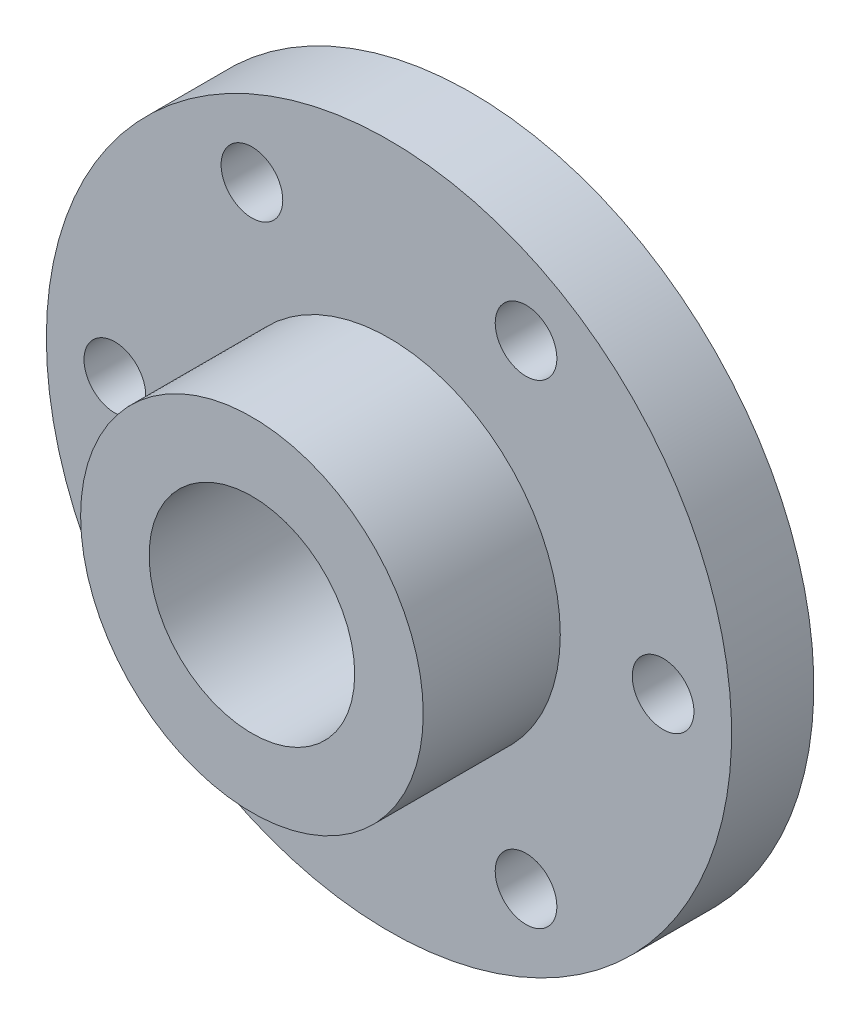
ISO-10303-21;
HEADER;
FILE_DESCRIPTION(('STEP AP214'),'2;1');
FILE_NAME('part.step','',(''),(''),'','','');
FILE_SCHEMA(('AUTOMOTIVE_DESIGN { 1 0 10303 214 1 1 1 1 }'));
ENDSEC;
DATA;
#1=APPLICATION_CONTEXT('core data for automotive mechanical design processes');
#2=APPLICATION_PROTOCOL_DEFINITION('international standard','automotive_design',2000,#1);
#3=PRODUCT_CONTEXT('',#1,'mechanical');
#4=PRODUCT('Part','Part','',(#3));
#5=PRODUCT_RELATED_PRODUCT_CATEGORY('part','',(#4));
#6=PRODUCT_DEFINITION_FORMATION('','',#4);
#7=PRODUCT_DEFINITION_CONTEXT('part definition',#1,'design');
#8=PRODUCT_DEFINITION('design','',#6,#7);
#9=PRODUCT_DEFINITION_SHAPE('','',#8);
#10=(LENGTH_UNIT() NAMED_UNIT(*) SI_UNIT(.MILLI.,.METRE.));
#11=(NAMED_UNIT(*) PLANE_ANGLE_UNIT() SI_UNIT($,.RADIAN.));
#12=(NAMED_UNIT(*) SI_UNIT($,.STERADIAN.) SOLID_ANGLE_UNIT());
#13=UNCERTAINTY_MEASURE_WITH_UNIT(LENGTH_MEASURE(1.E-05),#10,'distance_accuracy_value','');
#14=(GEOMETRIC_REPRESENTATION_CONTEXT(3) GLOBAL_UNCERTAINTY_ASSIGNED_CONTEXT((#13)) GLOBAL_UNIT_ASSIGNED_CONTEXT((#10,
#11,#12)) REPRESENTATION_CONTEXT('',''));
#15=CARTESIAN_POINT('',(0.,0.,0.));
#16=DIRECTION('',(0.,0.,1.));
#17=DIRECTION('',(1.,0.,0.));
#18=AXIS2_PLACEMENT_3D('',#15,#16,#17);
#19=CARTESIAN_POINT('',(0.,0.,0.));
#20=DIRECTION('',(0.,0.,1.));
#21=DIRECTION('',(1.,0.,0.));
#22=AXIS2_PLACEMENT_3D('',#19,#20,#21);
#23=PLANE('',#22);
#24=CARTESIAN_POINT('',(40.,0.,0.));
#25=DIRECTION('',(0.,0.,1.));
#26=DIRECTION('',(1.,0.,0.));
#27=AXIS2_PLACEMENT_3D('',#24,#25,#26);
#28=CIRCLE('',#27,4.5);
#29=CARTESIAN_POINT('',(44.5,0.,0.));
#30=VERTEX_POINT('',#29);
#31=EDGE_CURVE('E81',#30,#30,#28,.T.);
#32=ORIENTED_EDGE('',*,*,#31,.T.);
#33=EDGE_LOOP('',(#32));
#34=FACE_BOUND('',#33,.T.);
#35=CARTESIAN_POINT('',(20.,-34.641016,0.));
#36=DIRECTION('',(0.,0.,1.));
#37=DIRECTION('',(1.,0.,0.));
#38=AXIS2_PLACEMENT_3D('',#35,#36,#37);
#39=CIRCLE('',#38,4.5);
#40=CARTESIAN_POINT('',(24.5,-34.641016,0.));
#41=VERTEX_POINT('',#40);
#42=EDGE_CURVE('E154',#41,#41,#39,.T.);
#43=ORIENTED_EDGE('',*,*,#42,.T.);
#44=EDGE_LOOP('',(#43));
#45=FACE_BOUND('',#44,.T.);
#46=CARTESIAN_POINT('',(-20.,-34.641016,0.));
#47=DIRECTION('',(0.,0.,1.));
#48=DIRECTION('',(1.,0.,0.));
#49=AXIS2_PLACEMENT_3D('',#46,#47,#48);
#50=CIRCLE('',#49,4.5);
#51=CARTESIAN_POINT('',(-15.5,-34.641016,0.));
#52=VERTEX_POINT('',#51);
#53=EDGE_CURVE('E158',#52,#52,#50,.T.);
#54=ORIENTED_EDGE('',*,*,#53,.T.);
#55=EDGE_LOOP('',(#54));
#56=FACE_BOUND('',#55,.T.);
#57=CARTESIAN_POINT('',(-40.,0.,0.));
#58=DIRECTION('',(0.,0.,1.));
#59=DIRECTION('',(1.,0.,0.));
#60=AXIS2_PLACEMENT_3D('',#57,#58,#59);
#61=CIRCLE('',#60,4.5);
#62=CARTESIAN_POINT('',(-35.5,0.,0.));
#63=VERTEX_POINT('',#62);
#64=EDGE_CURVE('E162',#63,#63,#61,.T.);
#65=ORIENTED_EDGE('',*,*,#64,.T.);
#66=EDGE_LOOP('',(#65));
#67=FACE_BOUND('',#66,.T.);
#68=CARTESIAN_POINT('',(-20.,34.641016,0.));
#69=DIRECTION('',(0.,0.,1.));
#70=DIRECTION('',(1.,0.,0.));
#71=AXIS2_PLACEMENT_3D('',#68,#69,#70);
#72=CIRCLE('',#71,4.5);
#73=CARTESIAN_POINT('',(-15.5,34.641016,0.));
#74=VERTEX_POINT('',#73);
#75=EDGE_CURVE('E166',#74,#74,#72,.T.);
#76=ORIENTED_EDGE('',*,*,#75,.T.);
#77=EDGE_LOOP('',(#76));
#78=FACE_BOUND('',#77,.T.);
#79=CARTESIAN_POINT('',(20.,34.641016,0.));
#80=DIRECTION('',(0.,0.,1.));
#81=DIRECTION('',(1.,0.,0.));
#82=AXIS2_PLACEMENT_3D('',#79,#80,#81);
#83=CIRCLE('',#82,4.5);
#84=CARTESIAN_POINT('',(24.5,34.641016,0.));
#85=VERTEX_POINT('',#84);
#86=EDGE_CURVE('E169',#85,#85,#83,.T.);
#87=ORIENTED_EDGE('',*,*,#86,.T.);
#88=EDGE_LOOP('',(#87));
#89=FACE_BOUND('',#88,.T.);
#90=CARTESIAN_POINT('',(0.,0.,0.));
#91=DIRECTION('',(0.,0.,1.));
#92=DIRECTION('',(1.,0.,0.));
#93=AXIS2_PLACEMENT_3D('',#90,#91,#92);
#94=CIRCLE('',#93,35.);
#95=CARTESIAN_POINT('',(35.,0.,0.));
#96=VERTEX_POINT('',#95);
#97=EDGE_CURVE('E100',#96,#96,#94,.T.);
#98=ORIENTED_EDGE('',*,*,#97,.T.);
#99=EDGE_LOOP('',(#98));
#100=FACE_BOUND('',#99,.T.);
#101=CARTESIAN_POINT('',(0.,0.,0.));
#102=DIRECTION('',(0.,0.,-1.));
#103=DIRECTION('',(-1.,0.,0.));
#104=AXIS2_PLACEMENT_3D('',#101,#102,#103);
#105=CIRCLE('',#104,50.);
#106=CARTESIAN_POINT('',(-50.,0.,0.));
#107=VERTEX_POINT('',#106);
#108=EDGE_CURVE('E10',#107,#107,#105,.T.);
#109=ORIENTED_EDGE('',*,*,#108,.T.);
#110=EDGE_LOOP('',(#109));
#111=FACE_BOUND('',#110,.T.);
#112=ADVANCED_FACE('F49',(#34,#45,#56,#67,#78,#89,#100,#111),#23,.F.);
#113=CARTESIAN_POINT('',(0.,0.,0.));
#114=DIRECTION('',(0.,0.,-1.));
#115=DIRECTION('',(-1.,0.,0.));
#116=AXIS2_PLACEMENT_3D('',#113,#114,#115);
#117=CYLINDRICAL_SURFACE('',#116,50.);
#118=ORIENTED_EDGE('',*,*,#108,.F.);
#119=EDGE_LOOP('',(#118));
#120=FACE_BOUND('',#119,.T.);
#121=CARTESIAN_POINT('',(0.,0.,12.));
#122=DIRECTION('',(0.,0.,-1.));
#123=DIRECTION('',(-1.,0.,0.));
#124=AXIS2_PLACEMENT_3D('',#121,#122,#123);
#125=CIRCLE('',#124,50.);
#126=CARTESIAN_POINT('',(-50.,0.,12.));
#127=VERTEX_POINT('',#126);
#128=EDGE_CURVE('E58',#127,#127,#125,.T.);
#129=ORIENTED_EDGE('',*,*,#128,.T.);
#130=EDGE_LOOP('',(#129));
#131=FACE_BOUND('',#130,.T.);
#132=ADVANCED_FACE('F143',(#120,#131),#117,.T.);
#133=CARTESIAN_POINT('',(50.,0.,12.));
#134=DIRECTION('',(0.,0.,-1.));
#135=DIRECTION('',(-1.,0.,0.));
#136=AXIS2_PLACEMENT_3D('',#133,#134,#135);
#137=PLANE('',#136);
#138=CARTESIAN_POINT('',(40.,0.,12.));
#139=DIRECTION('',(0.,0.,-1.));
#140=DIRECTION('',(-1.,0.,0.));
#141=AXIS2_PLACEMENT_3D('',#138,#139,#140);
#142=CIRCLE('',#141,4.5);
#143=CARTESIAN_POINT('',(35.5,0.,12.));
#144=VERTEX_POINT('',#143);
#145=EDGE_CURVE('E53',#144,#144,#142,.T.);
#146=ORIENTED_EDGE('',*,*,#145,.T.);
#147=EDGE_LOOP('',(#146));
#148=FACE_BOUND('',#147,.T.);
#149=CARTESIAN_POINT('',(20.,-34.641016,12.));
#150=DIRECTION('',(0.,0.,-1.));
#151=DIRECTION('',(-1.,0.,0.));
#152=AXIS2_PLACEMENT_3D('',#149,#150,#151);
#153=CIRCLE('',#152,4.5);
#154=CARTESIAN_POINT('',(15.5,-34.641016,12.));
#155=VERTEX_POINT('',#154);
#156=EDGE_CURVE('E91',#155,#155,#153,.T.);
#157=ORIENTED_EDGE('',*,*,#156,.T.);
#158=EDGE_LOOP('',(#157));
#159=FACE_BOUND('',#158,.T.);
#160=CARTESIAN_POINT('',(-20.,-34.641016,12.));
#161=DIRECTION('',(0.,0.,-1.));
#162=DIRECTION('',(-1.,0.,0.));
#163=AXIS2_PLACEMENT_3D('',#160,#161,#162);
#164=CIRCLE('',#163,4.5);
#165=CARTESIAN_POINT('',(-24.5,-34.641016,12.));
#166=VERTEX_POINT('',#165);
#167=EDGE_CURVE('E88',#166,#166,#164,.T.);
#168=ORIENTED_EDGE('',*,*,#167,.T.);
#169=EDGE_LOOP('',(#168));
#170=FACE_BOUND('',#169,.T.);
#171=CARTESIAN_POINT('',(-40.,0.,12.));
#172=DIRECTION('',(0.,0.,-1.));
#173=DIRECTION('',(-1.,0.,0.));
#174=AXIS2_PLACEMENT_3D('',#171,#172,#173);
#175=CIRCLE('',#174,4.5);
#176=CARTESIAN_POINT('',(-44.5,0.,12.));
#177=VERTEX_POINT('',#176);
#178=EDGE_CURVE('E84',#177,#177,#175,.T.);
#179=ORIENTED_EDGE('',*,*,#178,.T.);
#180=EDGE_LOOP('',(#179));
#181=FACE_BOUND('',#180,.T.);
#182=CARTESIAN_POINT('',(-20.,34.641016,12.));
#183=DIRECTION('',(0.,0.,-1.));
#184=DIRECTION('',(-1.,0.,0.));
#185=AXIS2_PLACEMENT_3D('',#182,#183,#184);
#186=CIRCLE('',#185,4.5);
#187=CARTESIAN_POINT('',(-24.5,34.641016,12.));
#188=VERTEX_POINT('',#187);
#189=EDGE_CURVE('E80',#188,#188,#186,.T.);
#190=ORIENTED_EDGE('',*,*,#189,.T.);
#191=EDGE_LOOP('',(#190));
#192=FACE_BOUND('',#191,.T.);
#193=CARTESIAN_POINT('',(20.,34.641016,12.));
#194=DIRECTION('',(0.,0.,-1.));
#195=DIRECTION('',(-1.,0.,0.));
#196=AXIS2_PLACEMENT_3D('',#193,#194,#195);
#197=CIRCLE('',#196,4.5);
#198=CARTESIAN_POINT('',(15.5,34.641016,12.));
#199=VERTEX_POINT('',#198);
#200=EDGE_CURVE('E76',#199,#199,#197,.T.);
#201=ORIENTED_EDGE('',*,*,#200,.T.);
#202=EDGE_LOOP('',(#201));
#203=FACE_BOUND('',#202,.T.);
#204=ORIENTED_EDGE('',*,*,#128,.F.);
#205=EDGE_LOOP('',(#204));
#206=FACE_BOUND('',#205,.T.);
#207=CARTESIAN_POINT('',(0.,0.,12.));
#208=DIRECTION('',(0.,0.,-1.));
#209=DIRECTION('',(-1.,0.,0.));
#210=AXIS2_PLACEMENT_3D('',#207,#208,#209);
#211=CIRCLE('',#210,25.);
#212=CARTESIAN_POINT('',(-25.,0.,12.));
#213=VERTEX_POINT('',#212);
#214=EDGE_CURVE('E66',#213,#213,#211,.T.);
#215=ORIENTED_EDGE('',*,*,#214,.T.);
#216=EDGE_LOOP('',(#215));
#217=FACE_BOUND('',#216,.T.);
#218=ADVANCED_FACE('F122',(#148,#159,#170,#181,#192,#203,#206,#217),#137,.F.);
#219=CARTESIAN_POINT('',(0.,0.,0.));
#220=DIRECTION('',(0.,0.,-1.));
#221=DIRECTION('',(-1.,0.,0.));
#222=AXIS2_PLACEMENT_3D('',#219,#220,#221);
#223=CYLINDRICAL_SURFACE('',#222,25.);
#224=ORIENTED_EDGE('',*,*,#214,.F.);
#225=EDGE_LOOP('',(#224));
#226=FACE_BOUND('',#225,.T.);
#227=CARTESIAN_POINT('',(0.,0.,32.));
#228=DIRECTION('',(0.,0.,-1.));
#229=DIRECTION('',(-1.,0.,0.));
#230=AXIS2_PLACEMENT_3D('',#227,#228,#229);
#231=CIRCLE('',#230,25.);
#232=CARTESIAN_POINT('',(-25.,0.,32.));
#233=VERTEX_POINT('',#232);
#234=EDGE_CURVE('E116',#233,#233,#231,.T.);
#235=ORIENTED_EDGE('',*,*,#234,.T.);
#236=EDGE_LOOP('',(#235));
#237=FACE_BOUND('',#236,.T.);
#238=ADVANCED_FACE('F124',(#226,#237),#223,.T.);
#239=CARTESIAN_POINT('',(25.,0.,32.));
#240=DIRECTION('',(0.,0.,-1.));
#241=DIRECTION('',(-1.,0.,0.));
#242=AXIS2_PLACEMENT_3D('',#239,#240,#241);
#243=PLANE('',#242);
#244=CARTESIAN_POINT('',(0.,0.,32.));
#245=DIRECTION('',(0.,0.,1.));
#246=DIRECTION('',(1.,0.,0.));
#247=AXIS2_PLACEMENT_3D('',#244,#245,#246);
#248=CIRCLE('',#247,15.);
#249=CARTESIAN_POINT('',(15.,0.,32.));
#250=VERTEX_POINT('',#249);
#251=EDGE_CURVE('E74',#250,#250,#248,.T.);
#252=ORIENTED_EDGE('',*,*,#251,.F.);
#253=EDGE_LOOP('',(#252));
#254=FACE_BOUND('',#253,.T.);
#255=ORIENTED_EDGE('',*,*,#234,.F.);
#256=EDGE_LOOP('',(#255));
#257=FACE_BOUND('',#256,.T.);
#258=ADVANCED_FACE('F127',(#254,#257),#243,.F.);
#259=CARTESIAN_POINT('',(0.,0.,32.));
#260=DIRECTION('',(0.,0.,-1.));
#261=DIRECTION('',(-1.,0.,0.));
#262=AXIS2_PLACEMENT_3D('',#259,#260,#261);
#263=CYLINDRICAL_SURFACE('',#262,15.);
#264=CARTESIAN_POINT('',(0.,0.,3.));
#265=DIRECTION('',(0.,0.,1.));
#266=DIRECTION('',(1.,0.,0.));
#267=AXIS2_PLACEMENT_3D('',#264,#265,#266);
#268=CIRCLE('',#267,15.);
#269=CARTESIAN_POINT('',(15.,0.,3.));
#270=VERTEX_POINT('',#269);
#271=EDGE_CURVE('E70',#270,#270,#268,.T.);
#272=ORIENTED_EDGE('',*,*,#271,.F.);
#273=EDGE_LOOP('',(#272));
#274=FACE_BOUND('',#273,.T.);
#275=ORIENTED_EDGE('',*,*,#251,.T.);
#276=EDGE_LOOP('',(#275));
#277=FACE_BOUND('',#276,.T.);
#278=ADVANCED_FACE('F132',(#274,#277),#263,.F.);
#279=CARTESIAN_POINT('',(0.,0.,3.));
#280=DIRECTION('',(0.,0.,-1.));
#281=DIRECTION('',(-1.,0.,0.));
#282=AXIS2_PLACEMENT_3D('',#279,#280,#281);
#283=CYLINDRICAL_SURFACE('',#282,35.);
#284=CARTESIAN_POINT('',(0.,0.,3.));
#285=DIRECTION('',(0.,0.,1.));
#286=DIRECTION('',(1.,0.,0.));
#287=AXIS2_PLACEMENT_3D('',#284,#285,#286);
#288=CIRCLE('',#287,35.);
#289=CARTESIAN_POINT('',(35.,0.,3.));
#290=VERTEX_POINT('',#289);
#291=EDGE_CURVE('E75',#290,#290,#288,.T.);
#292=ORIENTED_EDGE('',*,*,#291,.T.);
#293=EDGE_LOOP('',(#292));
#294=FACE_BOUND('',#293,.T.);
#295=ORIENTED_EDGE('',*,*,#97,.F.);
#296=EDGE_LOOP('',(#295));
#297=FACE_BOUND('',#296,.T.);
#298=ADVANCED_FACE('F137',(#294,#297),#283,.F.);
#299=CARTESIAN_POINT('',(0.,0.,3.));
#300=DIRECTION('',(0.,0.,1.));
#301=DIRECTION('',(1.,0.,0.));
#302=AXIS2_PLACEMENT_3D('',#299,#300,#301);
#303=PLANE('',#302);
#304=ORIENTED_EDGE('',*,*,#271,.T.);
#305=EDGE_LOOP('',(#304));
#306=FACE_BOUND('',#305,.T.);
#307=ORIENTED_EDGE('',*,*,#291,.F.);
#308=EDGE_LOOP('',(#307));
#309=FACE_BOUND('',#308,.T.);
#310=ADVANCED_FACE('F184',(#306,#309),#303,.F.);
#311=CARTESIAN_POINT('',(20.,34.641016,0.));
#312=DIRECTION('',(0.,0.,1.));
#313=DIRECTION('',(1.,0.,0.));
#314=AXIS2_PLACEMENT_3D('',#311,#312,#313);
#315=CYLINDRICAL_SURFACE('',#314,4.5);
#316=ORIENTED_EDGE('',*,*,#86,.F.);
#317=EDGE_LOOP('',(#316));
#318=FACE_BOUND('',#317,.T.);
#319=ORIENTED_EDGE('',*,*,#200,.F.);
#320=EDGE_LOOP('',(#319));
#321=FACE_BOUND('',#320,.T.);
#322=ADVANCED_FACE('F180',(#318,#321),#315,.F.);
#323=CARTESIAN_POINT('',(-20.,34.641016,0.));
#324=DIRECTION('',(0.,0.,1.));
#325=DIRECTION('',(1.,0.,0.));
#326=AXIS2_PLACEMENT_3D('',#323,#324,#325);
#327=CYLINDRICAL_SURFACE('',#326,4.5);
#328=ORIENTED_EDGE('',*,*,#75,.F.);
#329=EDGE_LOOP('',(#328));
#330=FACE_BOUND('',#329,.T.);
#331=ORIENTED_EDGE('',*,*,#189,.F.);
#332=EDGE_LOOP('',(#331));
#333=FACE_BOUND('',#332,.T.);
#334=ADVANCED_FACE('F183',(#330,#333),#327,.F.);
#335=CARTESIAN_POINT('',(-40.,0.,0.));
#336=DIRECTION('',(0.,0.,1.));
#337=DIRECTION('',(1.,0.,0.));
#338=AXIS2_PLACEMENT_3D('',#335,#336,#337);
#339=CYLINDRICAL_SURFACE('',#338,4.5);
#340=ORIENTED_EDGE('',*,*,#64,.F.);
#341=EDGE_LOOP('',(#340));
#342=FACE_BOUND('',#341,.T.);
#343=ORIENTED_EDGE('',*,*,#178,.F.);
#344=EDGE_LOOP('',(#343));
#345=FACE_BOUND('',#344,.T.);
#346=ADVANCED_FACE('F213',(#342,#345),#339,.F.);
#347=CARTESIAN_POINT('',(-20.,-34.641016,0.));
#348=DIRECTION('',(0.,0.,1.));
#349=DIRECTION('',(1.,0.,0.));
#350=AXIS2_PLACEMENT_3D('',#347,#348,#349);
#351=CYLINDRICAL_SURFACE('',#350,4.5);
#352=ORIENTED_EDGE('',*,*,#53,.F.);
#353=EDGE_LOOP('',(#352));
#354=FACE_BOUND('',#353,.T.);
#355=ORIENTED_EDGE('',*,*,#167,.F.);
#356=EDGE_LOOP('',(#355));
#357=FACE_BOUND('',#356,.T.);
#358=ADVANCED_FACE('F204',(#354,#357),#351,.F.);
#359=CARTESIAN_POINT('',(20.,-34.641016,0.));
#360=DIRECTION('',(0.,0.,1.));
#361=DIRECTION('',(1.,0.,0.));
#362=AXIS2_PLACEMENT_3D('',#359,#360,#361);
#363=CYLINDRICAL_SURFACE('',#362,4.5);
#364=ORIENTED_EDGE('',*,*,#42,.F.);
#365=EDGE_LOOP('',(#364));
#366=FACE_BOUND('',#365,.T.);
#367=ORIENTED_EDGE('',*,*,#156,.F.);
#368=EDGE_LOOP('',(#367));
#369=FACE_BOUND('',#368,.T.);
#370=ADVANCED_FACE('F202',(#366,#369),#363,.F.);
#371=CARTESIAN_POINT('',(40.,0.,0.));
#372=DIRECTION('',(0.,0.,1.));
#373=DIRECTION('',(1.,0.,0.));
#374=AXIS2_PLACEMENT_3D('',#371,#372,#373);
#375=CYLINDRICAL_SURFACE('',#374,4.5);
#376=ORIENTED_EDGE('',*,*,#31,.F.);
#377=EDGE_LOOP('',(#376));
#378=FACE_BOUND('',#377,.T.);
#379=ORIENTED_EDGE('',*,*,#145,.F.);
#380=EDGE_LOOP('',(#379));
#381=FACE_BOUND('',#380,.T.);
#382=ADVANCED_FACE('F200',(#378,#381),#375,.F.);
#383=CLOSED_SHELL('',(#112,#132,#218,#238,#258,#278,#298,#310,#322,#334,#346,#358,#370,#382));
#384=MANIFOLD_SOLID_BREP('B2',#383);
#385=ADVANCED_BREP_SHAPE_REPRESENTATION('',(#18,#384),#14);
#386=SHAPE_DEFINITION_REPRESENTATION(#9,#385);
ENDSEC;
END-ISO-10303-21;
